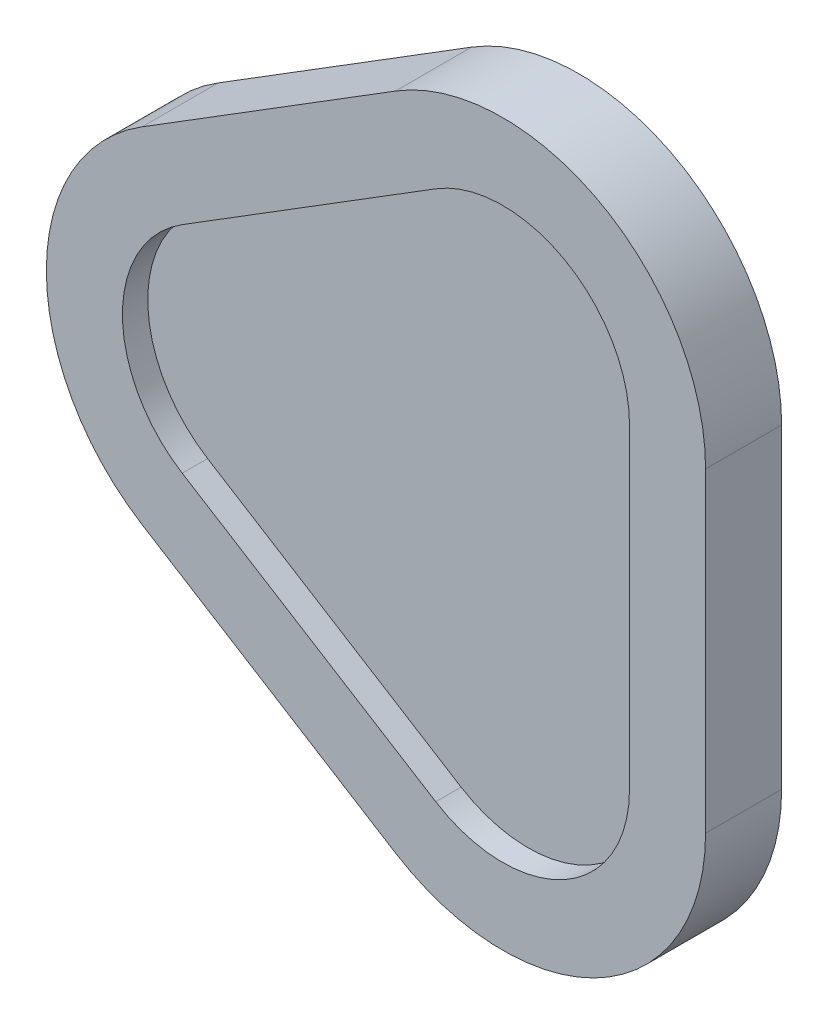
ISO-10303-21;
HEADER;
FILE_DESCRIPTION(('STEP AP214'),'2;1');
FILE_NAME('part.step','',(''),(''),'','','');
FILE_SCHEMA(('AUTOMOTIVE_DESIGN { 1 0 10303 214 1 1 1 1 }'));
ENDSEC;
DATA;
#1=APPLICATION_CONTEXT('core data for automotive mechanical design processes');
#2=APPLICATION_PROTOCOL_DEFINITION('international standard','automotive_design',2000,#1);
#3=PRODUCT_CONTEXT('',#1,'mechanical');
#4=PRODUCT('Part','Part','',(#3));
#5=PRODUCT_RELATED_PRODUCT_CATEGORY('part','',(#4));
#6=PRODUCT_DEFINITION_FORMATION('','',#4);
#7=PRODUCT_DEFINITION_CONTEXT('part definition',#1,'design');
#8=PRODUCT_DEFINITION('design','',#6,#7);
#9=PRODUCT_DEFINITION_SHAPE('','',#8);
#10=(LENGTH_UNIT() NAMED_UNIT(*) SI_UNIT(.MILLI.,.METRE.));
#11=(NAMED_UNIT(*) PLANE_ANGLE_UNIT() SI_UNIT($,.RADIAN.));
#12=(NAMED_UNIT(*) SI_UNIT($,.STERADIAN.) SOLID_ANGLE_UNIT());
#13=UNCERTAINTY_MEASURE_WITH_UNIT(LENGTH_MEASURE(1.E-05),#10,'distance_accuracy_value','');
#14=(GEOMETRIC_REPRESENTATION_CONTEXT(3) GLOBAL_UNCERTAINTY_ASSIGNED_CONTEXT((#13)) GLOBAL_UNIT_ASSIGNED_CONTEXT((#10,
#11,#12)) REPRESENTATION_CONTEXT('',''));
#15=CARTESIAN_POINT('',(0.,0.,0.));
#16=DIRECTION('',(0.,0.,1.));
#17=DIRECTION('',(1.,0.,0.));
#18=AXIS2_PLACEMENT_3D('',#15,#16,#17);
#19=CARTESIAN_POINT('',(-69.8627161537982,-15.6482685762915,15.));
#20=DIRECTION('',(0.,0.,1.));
#21=DIRECTION('',(1.,0.,0.));
#22=AXIS2_PLACEMENT_3D('',#19,#20,#21);
#23=PLANE('',#22);
#24=CARTESIAN_POINT('',(-69.8627161537982,-15.6482685762915,15.));
#25=DIRECTION('',(0.,0.,1.));
#26=DIRECTION('',(1.,0.,0.));
#27=AXIS2_PLACEMENT_3D('',#24,#25,#26);
#28=CIRCLE('',#27,40.);
#29=CARTESIAN_POINT('',(-90.9966049121084,18.3128672402764,15.));
#30=VERTEX_POINT('',#29);
#31=CARTESIAN_POINT('',(-90.9966049121083,-49.6094043928594,15.));
#32=VERTEX_POINT('',#31);
#33=EDGE_CURVE('E202',#30,#32,#28,.T.);
#34=ORIENTED_EDGE('',*,*,#33,.T.);
#35=DIRECTION('',(0.849028395414197,-0.528347218957754,0.));
#36=VECTOR('',#35,1.);
#37=CARTESIAN_POINT('',(-90.9966049121083,-49.6094043928594,15.));
#38=LINE('',#37,#36);
#39=CARTESIAN_POINT('',(-40.9966049121084,-80.7242187978594,15.));
#40=VERTEX_POINT('',#39);
#41=EDGE_CURVE('E206',#32,#40,#38,.T.);
#42=ORIENTED_EDGE('',*,*,#41,.T.);
#43=CARTESIAN_POINT('',(-19.8627161537982,-46.7630829812915,15.));
#44=DIRECTION('',(0.,0.,1.));
#45=DIRECTION('',(1.,0.,0.));
#46=AXIS2_PLACEMENT_3D('',#43,#44,#45);
#47=CIRCLE('',#46,40.);
#48=CARTESIAN_POINT('',(20.1372838462018,-46.7630829812915,15.));
#49=VERTEX_POINT('',#48);
#50=EDGE_CURVE('E210',#40,#49,#47,.T.);
#51=ORIENTED_EDGE('',*,*,#50,.T.);
#52=DIRECTION('',(0.,1.,0.));
#53=VECTOR('',#52,1.);
#54=CARTESIAN_POINT('',(20.1372838462018,-46.7630829812915,15.));
#55=LINE('',#54,#53);
#56=CARTESIAN_POINT('',(20.1372838462018,15.4665458287086,15.));
#57=VERTEX_POINT('',#56);
#58=EDGE_CURVE('E213',#49,#57,#55,.T.);
#59=ORIENTED_EDGE('',*,*,#58,.T.);
#60=CARTESIAN_POINT('',(-19.8627161537982,15.4665458287086,15.));
#61=DIRECTION('',(0.,0.,1.));
#62=DIRECTION('',(1.,0.,0.));
#63=AXIS2_PLACEMENT_3D('',#60,#61,#62);
#64=CIRCLE('',#63,40.);
#65=CARTESIAN_POINT('',(-40.9966049121084,49.4276816452765,15.));
#66=VERTEX_POINT('',#65);
#67=EDGE_CURVE('E216',#57,#66,#64,.T.);
#68=ORIENTED_EDGE('',*,*,#67,.T.);
#69=DIRECTION('',(0.849028395414197,0.528347218957755,0.));
#70=VECTOR('',#69,1.);
#71=CARTESIAN_POINT('',(-90.9966049121084,18.3128672402764,15.));
#72=LINE('',#71,#70);
#73=EDGE_CURVE('E219',#30,#66,#72,.T.);
#74=ORIENTED_EDGE('',*,*,#73,.F.);
#75=EDGE_LOOP('',(#34,#42,#51,#59,#68,#74));
#76=FACE_BOUND('',#75,.T.);
#77=DIRECTION('',(0.849028395414197,-0.528347218957754,0.));
#78=VECTOR('',#77,1.);
#79=CARTESIAN_POINT('',(-83.071396627742,-36.8739784616464,15.));
#80=LINE('',#79,#78);
#81=CARTESIAN_POINT('',(-83.071396627742,-36.8739784616464,15.));
#82=VERTEX_POINT('',#81);
#83=CARTESIAN_POINT('',(-33.071396627742,-67.9887928666464,15.));
#84=VERTEX_POINT('',#83);
#85=EDGE_CURVE('E190',#82,#84,#80,.T.);
#86=ORIENTED_EDGE('',*,*,#85,.F.);
#87=CARTESIAN_POINT('',(-69.8627161537982,-15.6482685762915,15.));
#88=DIRECTION('',(0.,0.,1.));
#89=DIRECTION('',(1.,0.,0.));
#90=AXIS2_PLACEMENT_3D('',#87,#88,#89);
#91=CIRCLE('',#90,25.);
#92=CARTESIAN_POINT('',(-83.071396627742,5.57744130906345,15.));
#93=VERTEX_POINT('',#92);
#94=EDGE_CURVE('E444',#93,#82,#91,.T.);
#95=ORIENTED_EDGE('',*,*,#94,.F.);
#96=DIRECTION('',(0.849028395414197,0.528347218957755,0.));
#97=VECTOR('',#96,1.);
#98=CARTESIAN_POINT('',(-83.071396627742,5.57744130906345,15.));
#99=LINE('',#98,#97);
#100=CARTESIAN_POINT('',(-33.0713966277421,36.6922557140635,15.));
#101=VERTEX_POINT('',#100);
#102=EDGE_CURVE('E419',#93,#101,#99,.T.);
#103=ORIENTED_EDGE('',*,*,#102,.T.);
#104=CARTESIAN_POINT('',(-19.8627161537982,15.4665458287086,15.));
#105=DIRECTION('',(0.,0.,1.));
#106=DIRECTION('',(1.,0.,0.));
#107=AXIS2_PLACEMENT_3D('',#104,#105,#106);
#108=CIRCLE('',#107,25.);
#109=CARTESIAN_POINT('',(5.13728384620183,15.4665458287086,15.));
#110=VERTEX_POINT('',#109);
#111=EDGE_CURVE('E426',#110,#101,#108,.T.);
#112=ORIENTED_EDGE('',*,*,#111,.F.);
#113=DIRECTION('',(0.,1.,0.));
#114=VECTOR('',#113,1.);
#115=CARTESIAN_POINT('',(5.13728384620182,-46.7630829812915,15.));
#116=LINE('',#115,#114);
#117=CARTESIAN_POINT('',(5.13728384620182,-46.7630829812915,15.));
#118=VERTEX_POINT('',#117);
#119=EDGE_CURVE('E433',#118,#110,#116,.T.);
#120=ORIENTED_EDGE('',*,*,#119,.F.);
#121=CARTESIAN_POINT('',(-19.8627161537982,-46.7630829812915,15.));
#122=DIRECTION('',(0.,0.,1.));
#123=DIRECTION('',(1.,0.,0.));
#124=AXIS2_PLACEMENT_3D('',#121,#122,#123);
#125=CIRCLE('',#124,25.);
#126=EDGE_CURVE('E437',#84,#118,#125,.T.);
#127=ORIENTED_EDGE('',*,*,#126,.F.);
#128=EDGE_LOOP('',(#86,#95,#103,#112,#120,#127));
#129=FACE_BOUND('',#128,.T.);
#130=ADVANCED_FACE('F75',(#76,#129),#23,.T.);
#131=CARTESIAN_POINT('',(-69.8627161537982,-15.6482685762915,0.));
#132=DIRECTION('',(0.,0.,1.));
#133=DIRECTION('',(1.,0.,0.));
#134=AXIS2_PLACEMENT_3D('',#131,#132,#133);
#135=PLANE('',#134);
#136=CARTESIAN_POINT('',(-69.8627161537982,-15.6482685762915,0.));
#137=DIRECTION('',(0.,0.,1.));
#138=DIRECTION('',(1.,0.,0.));
#139=AXIS2_PLACEMENT_3D('',#136,#137,#138);
#140=CIRCLE('',#139,40.);
#141=CARTESIAN_POINT('',(-90.9966049121084,18.3128672402764,0.));
#142=VERTEX_POINT('',#141);
#143=CARTESIAN_POINT('',(-90.9966049121083,-49.6094043928594,0.));
#144=VERTEX_POINT('',#143);
#145=EDGE_CURVE('E196',#142,#144,#140,.T.);
#146=ORIENTED_EDGE('',*,*,#145,.F.);
#147=DIRECTION('',(0.849028395414197,0.528347218957755,0.));
#148=VECTOR('',#147,1.);
#149=CARTESIAN_POINT('',(-90.9966049121084,18.3128672402764,0.));
#150=LINE('',#149,#148);
#151=CARTESIAN_POINT('',(-40.9966049121084,49.4276816452765,0.));
#152=VERTEX_POINT('',#151);
#153=EDGE_CURVE('E207',#142,#152,#150,.T.);
#154=ORIENTED_EDGE('',*,*,#153,.T.);
#155=CARTESIAN_POINT('',(-19.8627161537982,15.4665458287086,0.));
#156=DIRECTION('',(0.,0.,1.));
#157=DIRECTION('',(1.,0.,0.));
#158=AXIS2_PLACEMENT_3D('',#155,#156,#157);
#159=CIRCLE('',#158,40.);
#160=CARTESIAN_POINT('',(20.1372838462018,15.4665458287086,0.));
#161=VERTEX_POINT('',#160);
#162=EDGE_CURVE('E236',#161,#152,#159,.T.);
#163=ORIENTED_EDGE('',*,*,#162,.F.);
#164=DIRECTION('',(0.,1.,0.));
#165=VECTOR('',#164,1.);
#166=CARTESIAN_POINT('',(20.1372838462018,-46.7630829812915,0.));
#167=LINE('',#166,#165);
#168=CARTESIAN_POINT('',(20.1372838462018,-46.7630829812915,0.));
#169=VERTEX_POINT('',#168);
#170=EDGE_CURVE('E233',#169,#161,#167,.T.);
#171=ORIENTED_EDGE('',*,*,#170,.F.);
#172=CARTESIAN_POINT('',(-19.8627161537982,-46.7630829812915,0.));
#173=DIRECTION('',(0.,0.,1.));
#174=DIRECTION('',(1.,0.,0.));
#175=AXIS2_PLACEMENT_3D('',#172,#173,#174);
#176=CIRCLE('',#175,40.);
#177=CARTESIAN_POINT('',(-40.9966049121084,-80.7242187978594,0.));
#178=VERTEX_POINT('',#177);
#179=EDGE_CURVE('E230',#178,#169,#176,.T.);
#180=ORIENTED_EDGE('',*,*,#179,.F.);
#181=DIRECTION('',(0.849028395414197,-0.528347218957754,0.));
#182=VECTOR('',#181,1.);
#183=CARTESIAN_POINT('',(-90.9966049121083,-49.6094043928594,0.));
#184=LINE('',#183,#182);
#185=EDGE_CURVE('E227',#144,#178,#184,.T.);
#186=ORIENTED_EDGE('',*,*,#185,.F.);
#187=EDGE_LOOP('',(#146,#154,#163,#171,#180,#186));
#188=FACE_BOUND('',#187,.T.);
#189=ADVANCED_FACE('F267',(#188),#135,.F.);
#190=CARTESIAN_POINT('',(-69.8627161537982,-15.6482685762915,15.));
#191=DIRECTION('',(0.,0.,-1.));
#192=DIRECTION('',(-1.,0.,0.));
#193=AXIS2_PLACEMENT_3D('',#190,#191,#192);
#194=CYLINDRICAL_SURFACE('',#193,40.);
#195=ORIENTED_EDGE('',*,*,#145,.T.);
#196=DIRECTION('',(0.,0.,-1.));
#197=VECTOR('',#196,1.);
#198=CARTESIAN_POINT('',(-90.9966049121083,-49.6094043928594,15.));
#199=LINE('',#198,#197);
#200=EDGE_CURVE('E12',#32,#144,#199,.T.);
#201=ORIENTED_EDGE('',*,*,#200,.F.);
#202=ORIENTED_EDGE('',*,*,#33,.F.);
#203=DIRECTION('',(0.,0.,-1.));
#204=VECTOR('',#203,1.);
#205=CARTESIAN_POINT('',(-90.9966049121084,18.3128672402764,15.));
#206=LINE('',#205,#204);
#207=EDGE_CURVE('E223',#30,#142,#206,.T.);
#208=ORIENTED_EDGE('',*,*,#207,.T.);
#209=EDGE_LOOP('',(#195,#201,#202,#208));
#210=FACE_BOUND('',#209,.T.);
#211=ADVANCED_FACE('F77',(#210),#194,.T.);
#212=CARTESIAN_POINT('',(-90.9966049121083,-49.6094043928594,15.));
#213=DIRECTION('',(0.528347218957754,0.849028395414197,0.));
#214=DIRECTION('',(-0.849028395414198,0.528347218957755,0.));
#215=AXIS2_PLACEMENT_3D('',#212,#213,#214);
#216=PLANE('',#215);
#217=ORIENTED_EDGE('',*,*,#185,.T.);
#218=DIRECTION('',(0.,0.,-1.));
#219=VECTOR('',#218,1.);
#220=CARTESIAN_POINT('',(-40.9966049121084,-80.7242187978594,15.));
#221=LINE('',#220,#219);
#222=EDGE_CURVE('E84',#40,#178,#221,.T.);
#223=ORIENTED_EDGE('',*,*,#222,.F.);
#224=ORIENTED_EDGE('',*,*,#41,.F.);
#225=ORIENTED_EDGE('',*,*,#200,.T.);
#226=EDGE_LOOP('',(#217,#223,#224,#225));
#227=FACE_BOUND('',#226,.T.);
#228=ADVANCED_FACE('F282',(#227),#216,.F.);
#229=CARTESIAN_POINT('',(-19.8627161537982,-46.7630829812915,15.));
#230=DIRECTION('',(0.,0.,-1.));
#231=DIRECTION('',(-1.,0.,0.));
#232=AXIS2_PLACEMENT_3D('',#229,#230,#231);
#233=CYLINDRICAL_SURFACE('',#232,40.);
#234=ORIENTED_EDGE('',*,*,#179,.T.);
#235=DIRECTION('',(0.,0.,-1.));
#236=VECTOR('',#235,1.);
#237=CARTESIAN_POINT('',(20.1372838462018,-46.7630829812915,15.));
#238=LINE('',#237,#236);
#239=EDGE_CURVE('E252',#49,#169,#238,.T.);
#240=ORIENTED_EDGE('',*,*,#239,.F.);
#241=ORIENTED_EDGE('',*,*,#50,.F.);
#242=ORIENTED_EDGE('',*,*,#222,.T.);
#243=EDGE_LOOP('',(#234,#240,#241,#242));
#244=FACE_BOUND('',#243,.T.);
#245=ADVANCED_FACE('F261',(#244),#233,.T.);
#246=CARTESIAN_POINT('',(20.1372838462018,-46.7630829812915,15.));
#247=DIRECTION('',(-1.,0.,0.));
#248=DIRECTION('',(0.,-1.,0.));
#249=AXIS2_PLACEMENT_3D('',#246,#247,#248);
#250=PLANE('',#249);
#251=ORIENTED_EDGE('',*,*,#170,.T.);
#252=DIRECTION('',(0.,0.,-1.));
#253=VECTOR('',#252,1.);
#254=CARTESIAN_POINT('',(20.1372838462018,15.4665458287086,15.));
#255=LINE('',#254,#253);
#256=EDGE_CURVE('E248',#57,#161,#255,.T.);
#257=ORIENTED_EDGE('',*,*,#256,.F.);
#258=ORIENTED_EDGE('',*,*,#58,.F.);
#259=ORIENTED_EDGE('',*,*,#239,.T.);
#260=EDGE_LOOP('',(#251,#257,#258,#259));
#261=FACE_BOUND('',#260,.T.);
#262=ADVANCED_FACE('F271',(#261),#250,.F.);
#263=CARTESIAN_POINT('',(-19.8627161537982,15.4665458287086,15.));
#264=DIRECTION('',(0.,0.,-1.));
#265=DIRECTION('',(-1.,0.,0.));
#266=AXIS2_PLACEMENT_3D('',#263,#264,#265);
#267=CYLINDRICAL_SURFACE('',#266,40.);
#268=ORIENTED_EDGE('',*,*,#162,.T.);
#269=DIRECTION('',(0.,0.,-1.));
#270=VECTOR('',#269,1.);
#271=CARTESIAN_POINT('',(-40.9966049121084,49.4276816452765,15.));
#272=LINE('',#271,#270);
#273=EDGE_CURVE('E245',#66,#152,#272,.T.);
#274=ORIENTED_EDGE('',*,*,#273,.F.);
#275=ORIENTED_EDGE('',*,*,#67,.F.);
#276=ORIENTED_EDGE('',*,*,#256,.T.);
#277=EDGE_LOOP('',(#268,#274,#275,#276));
#278=FACE_BOUND('',#277,.T.);
#279=ADVANCED_FACE('F275',(#278),#267,.T.);
#280=CARTESIAN_POINT('',(-90.9966049121084,18.3128672402764,15.));
#281=DIRECTION('',(-0.528347218957755,0.849028395414197,0.));
#282=DIRECTION('',(-0.849028395414197,-0.528347218957755,0.));
#283=AXIS2_PLACEMENT_3D('',#280,#281,#282);
#284=PLANE('',#283);
#285=ORIENTED_EDGE('',*,*,#153,.F.);
#286=ORIENTED_EDGE('',*,*,#207,.F.);
#287=ORIENTED_EDGE('',*,*,#73,.T.);
#288=ORIENTED_EDGE('',*,*,#273,.T.);
#289=EDGE_LOOP('',(#285,#286,#287,#288));
#290=FACE_BOUND('',#289,.T.);
#291=ADVANCED_FACE('F286',(#290),#284,.T.);
#292=CARTESIAN_POINT('',(-69.8627161537982,-15.6482685762915,15.));
#293=DIRECTION('',(0.,0.,-1.));
#294=DIRECTION('',(-1.,0.,0.));
#295=AXIS2_PLACEMENT_3D('',#292,#293,#294);
#296=CYLINDRICAL_SURFACE('',#295,25.);
#297=CARTESIAN_POINT('',(-69.8627161537982,-15.6482685762915,10.));
#298=DIRECTION('',(0.,0.,1.));
#299=DIRECTION('',(1.,0.,0.));
#300=AXIS2_PLACEMENT_3D('',#297,#298,#299);
#301=CIRCLE('',#300,25.);
#302=CARTESIAN_POINT('',(-83.071396627742,5.57744130906347,10.));
#303=VERTEX_POINT('',#302);
#304=CARTESIAN_POINT('',(-83.071396627742,-36.8739784616464,10.));
#305=VERTEX_POINT('',#304);
#306=EDGE_CURVE('E170',#303,#305,#301,.T.);
#307=ORIENTED_EDGE('',*,*,#306,.F.);
#308=DIRECTION('',(0.,0.,-1.));
#309=VECTOR('',#308,1.);
#310=CARTESIAN_POINT('',(-83.071396627742,5.57744130906345,15.));
#311=LINE('',#310,#309);
#312=EDGE_CURVE('E416',#93,#303,#311,.T.);
#313=ORIENTED_EDGE('',*,*,#312,.F.);
#314=ORIENTED_EDGE('',*,*,#94,.T.);
#315=DIRECTION('',(0.,0.,-1.));
#316=VECTOR('',#315,1.);
#317=CARTESIAN_POINT('',(-83.071396627742,-36.8739784616464,15.));
#318=LINE('',#317,#316);
#319=EDGE_CURVE('E192',#82,#305,#318,.T.);
#320=ORIENTED_EDGE('',*,*,#319,.T.);
#321=EDGE_LOOP('',(#307,#313,#314,#320));
#322=FACE_BOUND('',#321,.T.);
#323=ADVANCED_FACE('F288',(#322),#296,.F.);
#324=CARTESIAN_POINT('',(-83.071396627742,-36.8739784616464,15.));
#325=DIRECTION('',(0.528347218957754,0.849028395414197,0.));
#326=DIRECTION('',(-0.849028395414198,0.528347218957755,0.));
#327=AXIS2_PLACEMENT_3D('',#324,#325,#326);
#328=PLANE('',#327);
#329=DIRECTION('',(0.849028395414197,-0.528347218957755,0.));
#330=VECTOR('',#329,1.);
#331=CARTESIAN_POINT('',(-39.7304407976502,-63.8448943974187,10.));
#332=LINE('',#331,#330);
#333=CARTESIAN_POINT('',(-33.071396627742,-67.9887928666464,10.));
#334=VERTEX_POINT('',#333);
#335=EDGE_CURVE('E164',#305,#334,#332,.T.);
#336=ORIENTED_EDGE('',*,*,#335,.F.);
#337=ORIENTED_EDGE('',*,*,#319,.F.);
#338=ORIENTED_EDGE('',*,*,#85,.T.);
#339=DIRECTION('',(0.,0.,-1.));
#340=VECTOR('',#339,1.);
#341=CARTESIAN_POINT('',(-33.071396627742,-67.9887928666464,15.));
#342=LINE('',#341,#340);
#343=EDGE_CURVE('E181',#84,#334,#342,.T.);
#344=ORIENTED_EDGE('',*,*,#343,.T.);
#345=EDGE_LOOP('',(#336,#337,#338,#344));
#346=FACE_BOUND('',#345,.T.);
#347=ADVANCED_FACE('F188',(#346),#328,.T.);
#348=CARTESIAN_POINT('',(-19.8627161537982,-46.7630829812915,15.));
#349=DIRECTION('',(0.,0.,-1.));
#350=DIRECTION('',(-1.,0.,0.));
#351=AXIS2_PLACEMENT_3D('',#348,#349,#350);
#352=CYLINDRICAL_SURFACE('',#351,25.);
#353=CARTESIAN_POINT('',(-19.8627161537982,-46.7630829812915,10.));
#354=DIRECTION('',(0.,0.,1.));
#355=DIRECTION('',(1.,0.,0.));
#356=AXIS2_PLACEMENT_3D('',#353,#354,#355);
#357=CIRCLE('',#356,25.);
#358=CARTESIAN_POINT('',(5.13728384620182,-46.7630829812915,10.));
#359=VERTEX_POINT('',#358);
#360=EDGE_CURVE('E167',#334,#359,#357,.T.);
#361=ORIENTED_EDGE('',*,*,#360,.F.);
#362=ORIENTED_EDGE('',*,*,#343,.F.);
#363=ORIENTED_EDGE('',*,*,#126,.T.);
#364=DIRECTION('',(0.,0.,-1.));
#365=VECTOR('',#364,1.);
#366=CARTESIAN_POINT('',(5.13728384620182,-46.7630829812915,15.));
#367=LINE('',#366,#365);
#368=EDGE_CURVE('E184',#118,#359,#367,.T.);
#369=ORIENTED_EDGE('',*,*,#368,.T.);
#370=EDGE_LOOP('',(#361,#362,#363,#369));
#371=FACE_BOUND('',#370,.T.);
#372=ADVANCED_FACE('F180',(#371),#352,.F.);
#373=CARTESIAN_POINT('',(5.13728384620182,-46.7630829812915,15.));
#374=DIRECTION('',(-1.,0.,0.));
#375=DIRECTION('',(0.,-1.,0.));
#376=AXIS2_PLACEMENT_3D('',#373,#374,#375);
#377=PLANE('',#376);
#378=DIRECTION('',(0.,1.,0.));
#379=VECTOR('',#378,1.);
#380=CARTESIAN_POINT('',(5.13728384620183,0.,10.));
#381=LINE('',#380,#379);
#382=CARTESIAN_POINT('',(5.13728384620183,15.4665458287086,10.));
#383=VERTEX_POINT('',#382);
#384=EDGE_CURVE('E186',#359,#383,#381,.T.);
#385=ORIENTED_EDGE('',*,*,#384,.F.);
#386=ORIENTED_EDGE('',*,*,#368,.F.);
#387=ORIENTED_EDGE('',*,*,#119,.T.);
#388=DIRECTION('',(0.,0.,-1.));
#389=VECTOR('',#388,1.);
#390=CARTESIAN_POINT('',(5.13728384620183,15.4665458287086,15.));
#391=LINE('',#390,#389);
#392=EDGE_CURVE('E198',#110,#383,#391,.T.);
#393=ORIENTED_EDGE('',*,*,#392,.T.);
#394=EDGE_LOOP('',(#385,#386,#387,#393));
#395=FACE_BOUND('',#394,.T.);
#396=ADVANCED_FACE('F308',(#395),#377,.T.);
#397=CARTESIAN_POINT('',(-19.8627161537982,15.4665458287086,15.));
#398=DIRECTION('',(0.,0.,-1.));
#399=DIRECTION('',(-1.,0.,0.));
#400=AXIS2_PLACEMENT_3D('',#397,#398,#399);
#401=CYLINDRICAL_SURFACE('',#400,25.);
#402=CARTESIAN_POINT('',(-19.8627161537982,15.4665458287086,10.));
#403=DIRECTION('',(0.,0.,1.));
#404=DIRECTION('',(1.,0.,0.));
#405=AXIS2_PLACEMENT_3D('',#402,#403,#404);
#406=CIRCLE('',#405,25.);
#407=CARTESIAN_POINT('',(-33.0713966277421,36.6922557140635,10.));
#408=VERTEX_POINT('',#407);
#409=EDGE_CURVE('E91',#383,#408,#406,.T.);
#410=ORIENTED_EDGE('',*,*,#409,.F.);
#411=ORIENTED_EDGE('',*,*,#392,.F.);
#412=ORIENTED_EDGE('',*,*,#111,.T.);
#413=DIRECTION('',(0.,0.,-1.));
#414=VECTOR('',#413,1.);
#415=CARTESIAN_POINT('',(-33.0713966277421,36.6922557140635,15.));
#416=LINE('',#415,#414);
#417=EDGE_CURVE('E98',#101,#408,#416,.T.);
#418=ORIENTED_EDGE('',*,*,#417,.T.);
#419=EDGE_LOOP('',(#410,#411,#412,#418));
#420=FACE_BOUND('',#419,.T.);
#421=ADVANCED_FACE('F311',(#420),#401,.F.);
#422=CARTESIAN_POINT('',(-83.071396627742,5.57744130906345,15.));
#423=DIRECTION('',(-0.528347218957755,0.849028395414197,0.));
#424=DIRECTION('',(-0.849028395414197,-0.528347218957755,0.));
#425=AXIS2_PLACEMENT_3D('',#422,#423,#424);
#426=PLANE('',#425);
#427=ORIENTED_EDGE('',*,*,#312,.T.);
#428=DIRECTION('',(0.849028395414197,0.528347218957755,0.));
#429=VECTOR('',#428,1.);
#430=CARTESIAN_POINT('',(-25.6913840929574,41.2848101205915,10.));
#431=LINE('',#430,#429);
#432=EDGE_CURVE('E417',#303,#408,#431,.T.);
#433=ORIENTED_EDGE('',*,*,#432,.T.);
#434=ORIENTED_EDGE('',*,*,#417,.F.);
#435=ORIENTED_EDGE('',*,*,#102,.F.);
#436=EDGE_LOOP('',(#427,#433,#434,#435));
#437=FACE_BOUND('',#436,.T.);
#438=ADVANCED_FACE('F315',(#437),#426,.F.);
#439=CARTESIAN_POINT('',(0.,0.,10.));
#440=DIRECTION('',(0.,0.,1.));
#441=DIRECTION('',(1.,0.,0.));
#442=AXIS2_PLACEMENT_3D('',#439,#440,#441);
#443=PLANE('',#442);
#444=ORIENTED_EDGE('',*,*,#335,.T.);
#445=ORIENTED_EDGE('',*,*,#360,.T.);
#446=ORIENTED_EDGE('',*,*,#384,.T.);
#447=ORIENTED_EDGE('',*,*,#409,.T.);
#448=ORIENTED_EDGE('',*,*,#432,.F.);
#449=ORIENTED_EDGE('',*,*,#306,.T.);
#450=EDGE_LOOP('',(#444,#445,#446,#447,#448,#449));
#451=FACE_BOUND('',#450,.T.);
#452=ADVANCED_FACE('F166',(#451),#443,.T.);
#453=CLOSED_SHELL('',(#130,#189,#211,#228,#245,#262,#279,#291,#323,#347,#372,#396,#421,#438,#452));
#454=MANIFOLD_SOLID_BREP('B2',#453);
#455=ADVANCED_BREP_SHAPE_REPRESENTATION('',(#18,#454),#14);
#456=SHAPE_DEFINITION_REPRESENTATION(#9,#455);
ENDSEC;
END-ISO-10303-21;
